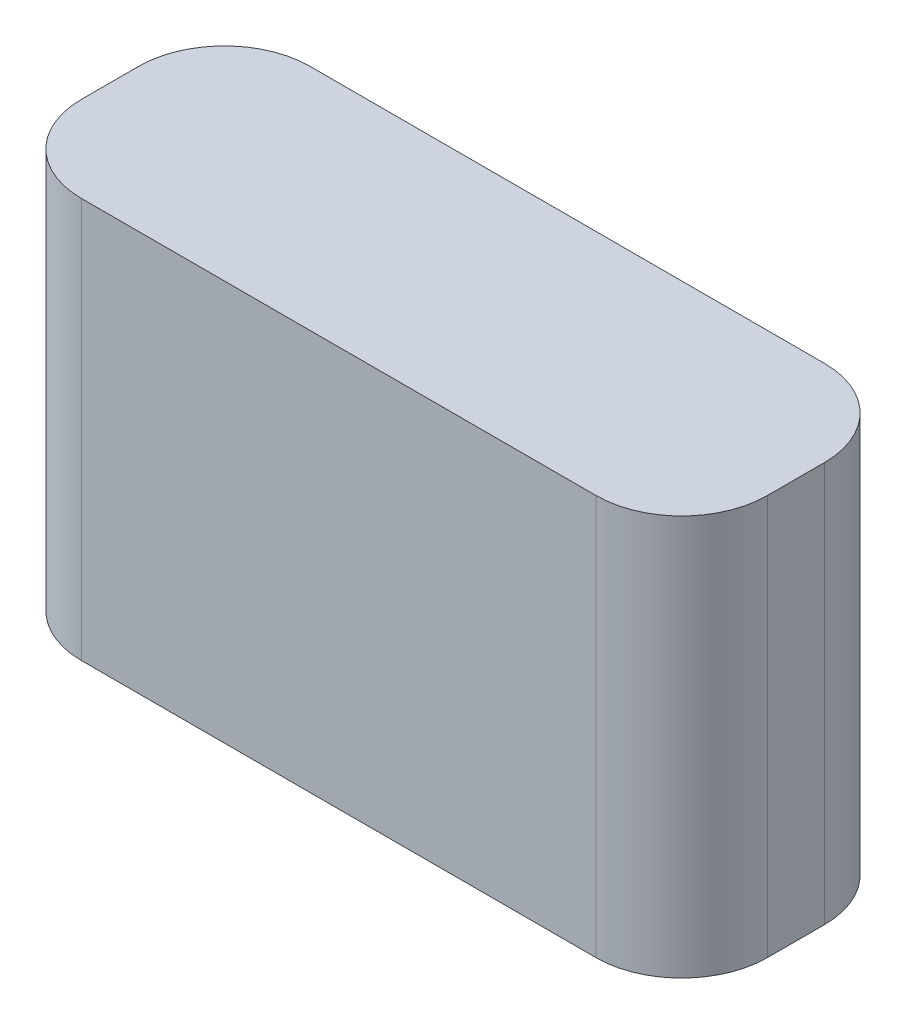
ISO-10303-21;
HEADER;
FILE_DESCRIPTION(('STEP AP214'),'2;1');
FILE_NAME('part.step','',(''),(''),'','','');
FILE_SCHEMA(('AUTOMOTIVE_DESIGN { 1 0 10303 214 1 1 1 1 }'));
ENDSEC;
DATA;
#1=APPLICATION_CONTEXT('core data for automotive mechanical design processes');
#2=APPLICATION_PROTOCOL_DEFINITION('international standard','automotive_design',2000,#1);
#3=PRODUCT_CONTEXT('',#1,'mechanical');
#4=PRODUCT('Part','Part','',(#3));
#5=PRODUCT_RELATED_PRODUCT_CATEGORY('part','',(#4));
#6=PRODUCT_DEFINITION_FORMATION('','',#4);
#7=PRODUCT_DEFINITION_CONTEXT('part definition',#1,'design');
#8=PRODUCT_DEFINITION('design','',#6,#7);
#9=PRODUCT_DEFINITION_SHAPE('','',#8);
#10=(LENGTH_UNIT() NAMED_UNIT(*) SI_UNIT(.MILLI.,.METRE.));
#11=(NAMED_UNIT(*) PLANE_ANGLE_UNIT() SI_UNIT($,.RADIAN.));
#12=(NAMED_UNIT(*) SI_UNIT($,.STERADIAN.) SOLID_ANGLE_UNIT());
#13=UNCERTAINTY_MEASURE_WITH_UNIT(LENGTH_MEASURE(1.E-05),#10,'distance_accuracy_value','');
#14=(GEOMETRIC_REPRESENTATION_CONTEXT(3) GLOBAL_UNCERTAINTY_ASSIGNED_CONTEXT((#13)) GLOBAL_UNIT_ASSIGNED_CONTEXT((#10,
#11,#12)) REPRESENTATION_CONTEXT('',''));
#15=CARTESIAN_POINT('',(0.,0.,0.));
#16=DIRECTION('',(0.,0.,1.));
#17=DIRECTION('',(1.,0.,0.));
#18=AXIS2_PLACEMENT_3D('',#15,#16,#17);
#19=CARTESIAN_POINT('',(45.,70.,-5.00000000000001));
#20=DIRECTION('',(0.,-1.,0.));
#21=DIRECTION('',(0.,0.,-1.));
#22=AXIS2_PLACEMENT_3D('',#19,#20,#21);
#23=CYLINDRICAL_SURFACE('',#22,15.);
#24=CARTESIAN_POINT('',(45.,0.,-5.00000000000001));
#25=DIRECTION('',(0.,1.,0.));
#26=DIRECTION('',(0.,0.,-1.));
#27=AXIS2_PLACEMENT_3D('',#24,#25,#26);
#28=CIRCLE('',#27,15.);
#29=CARTESIAN_POINT('',(60.,0.,-5.00000000000001));
#30=VERTEX_POINT('',#29);
#31=CARTESIAN_POINT('',(45.,0.,-20.));
#32=VERTEX_POINT('',#31);
#33=EDGE_CURVE('E135',#30,#32,#28,.T.);
#34=ORIENTED_EDGE('',*,*,#33,.T.);
#35=DIRECTION('',(0.,-1.,0.));
#36=VECTOR('',#35,1.);
#37=CARTESIAN_POINT('',(45.,70.,-20.));
#38=LINE('',#37,#36);
#39=CARTESIAN_POINT('',(45.,70.,-20.));
#40=VERTEX_POINT('',#39);
#41=EDGE_CURVE('E11',#40,#32,#38,.T.);
#42=ORIENTED_EDGE('',*,*,#41,.F.);
#43=CARTESIAN_POINT('',(45.,70.,-5.00000000000001));
#44=DIRECTION('',(0.,1.,0.));
#45=DIRECTION('',(0.,0.,-1.));
#46=AXIS2_PLACEMENT_3D('',#43,#44,#45);
#47=CIRCLE('',#46,15.);
#48=CARTESIAN_POINT('',(60.,70.,-5.00000000000001));
#49=VERTEX_POINT('',#48);
#50=EDGE_CURVE('E149',#49,#40,#47,.T.);
#51=ORIENTED_EDGE('',*,*,#50,.F.);
#52=DIRECTION('',(0.,-1.,0.));
#53=VECTOR('',#52,1.);
#54=CARTESIAN_POINT('',(60.,70.,-5.00000000000001));
#55=LINE('',#54,#53);
#56=EDGE_CURVE('E131',#49,#30,#55,.T.);
#57=ORIENTED_EDGE('',*,*,#56,.T.);
#58=EDGE_LOOP('',(#34,#42,#51,#57));
#59=FACE_BOUND('',#58,.T.);
#60=ADVANCED_FACE('F39',(#59),#23,.T.);
#61=CARTESIAN_POINT('',(-45.,70.,-20.));
#62=DIRECTION('',(0.,0.,1.));
#63=DIRECTION('',(1.,0.,0.));
#64=AXIS2_PLACEMENT_3D('',#61,#62,#63);
#65=PLANE('',#64);
#66=DIRECTION('',(-1.,0.,0.));
#67=VECTOR('',#66,1.);
#68=CARTESIAN_POINT('',(-45.,0.,-20.));
#69=LINE('',#68,#67);
#70=CARTESIAN_POINT('',(-45.,0.,-20.));
#71=VERTEX_POINT('',#70);
#72=EDGE_CURVE('E138',#32,#71,#69,.T.);
#73=ORIENTED_EDGE('',*,*,#72,.T.);
#74=DIRECTION('',(0.,-1.,0.));
#75=VECTOR('',#74,1.);
#76=CARTESIAN_POINT('',(-45.,70.,-20.));
#77=LINE('',#76,#75);
#78=CARTESIAN_POINT('',(-45.,70.,-20.));
#79=VERTEX_POINT('',#78);
#80=EDGE_CURVE('E47',#79,#71,#77,.T.);
#81=ORIENTED_EDGE('',*,*,#80,.F.);
#82=DIRECTION('',(-1.,0.,0.));
#83=VECTOR('',#82,1.);
#84=CARTESIAN_POINT('',(-45.,70.,-20.));
#85=LINE('',#84,#83);
#86=EDGE_CURVE('E98',#40,#79,#85,.T.);
#87=ORIENTED_EDGE('',*,*,#86,.F.);
#88=ORIENTED_EDGE('',*,*,#41,.T.);
#89=EDGE_LOOP('',(#73,#81,#87,#88));
#90=FACE_BOUND('',#89,.T.);
#91=ADVANCED_FACE('F184',(#90),#65,.F.);
#92=CARTESIAN_POINT('',(-45.,70.,-5.00000000000001));
#93=DIRECTION('',(0.,-1.,0.));
#94=DIRECTION('',(0.,0.,-1.));
#95=AXIS2_PLACEMENT_3D('',#92,#93,#94);
#96=CYLINDRICAL_SURFACE('',#95,15.);
#97=CARTESIAN_POINT('',(-45.,0.,-5.00000000000001));
#98=DIRECTION('',(0.,1.,0.));
#99=DIRECTION('',(0.,0.,-1.));
#100=AXIS2_PLACEMENT_3D('',#97,#98,#99);
#101=CIRCLE('',#100,15.);
#102=CARTESIAN_POINT('',(-60.,0.,-5.00000000000001));
#103=VERTEX_POINT('',#102);
#104=EDGE_CURVE('E140',#71,#103,#101,.T.);
#105=ORIENTED_EDGE('',*,*,#104,.T.);
#106=DIRECTION('',(0.,-1.,0.));
#107=VECTOR('',#106,1.);
#108=CARTESIAN_POINT('',(-60.,70.,-5.00000000000001));
#109=LINE('',#108,#107);
#110=CARTESIAN_POINT('',(-60.,70.,-5.00000000000001));
#111=VERTEX_POINT('',#110);
#112=EDGE_CURVE('E156',#111,#103,#109,.T.);
#113=ORIENTED_EDGE('',*,*,#112,.F.);
#114=CARTESIAN_POINT('',(-45.,70.,-5.00000000000001));
#115=DIRECTION('',(0.,1.,0.));
#116=DIRECTION('',(0.,0.,-1.));
#117=AXIS2_PLACEMENT_3D('',#114,#115,#116);
#118=CIRCLE('',#117,15.);
#119=EDGE_CURVE('E164',#79,#111,#118,.T.);
#120=ORIENTED_EDGE('',*,*,#119,.F.);
#121=ORIENTED_EDGE('',*,*,#80,.T.);
#122=EDGE_LOOP('',(#105,#113,#120,#121));
#123=FACE_BOUND('',#122,.T.);
#124=ADVANCED_FACE('F162',(#123),#96,.T.);
#125=CARTESIAN_POINT('',(-60.,70.,4.99999999999999));
#126=DIRECTION('',(1.,0.,0.));
#127=DIRECTION('',(0.,0.,-1.));
#128=AXIS2_PLACEMENT_3D('',#125,#126,#127);
#129=PLANE('',#128);
#130=DIRECTION('',(0.,0.,1.));
#131=VECTOR('',#130,1.);
#132=CARTESIAN_POINT('',(-60.,0.,4.99999999999999));
#133=LINE('',#132,#131);
#134=CARTESIAN_POINT('',(-60.,0.,4.99999999999999));
#135=VERTEX_POINT('',#134);
#136=EDGE_CURVE('E142',#103,#135,#133,.T.);
#137=ORIENTED_EDGE('',*,*,#136,.T.);
#138=DIRECTION('',(0.,-1.,0.));
#139=VECTOR('',#138,1.);
#140=CARTESIAN_POINT('',(-60.,70.,4.99999999999999));
#141=LINE('',#140,#139);
#142=CARTESIAN_POINT('',(-60.,70.,4.99999999999999));
#143=VERTEX_POINT('',#142);
#144=EDGE_CURVE('E153',#143,#135,#141,.T.);
#145=ORIENTED_EDGE('',*,*,#144,.F.);
#146=DIRECTION('',(0.,0.,1.));
#147=VECTOR('',#146,1.);
#148=CARTESIAN_POINT('',(-60.,70.,4.99999999999999));
#149=LINE('',#148,#147);
#150=EDGE_CURVE('E176',#111,#143,#149,.T.);
#151=ORIENTED_EDGE('',*,*,#150,.F.);
#152=ORIENTED_EDGE('',*,*,#112,.T.);
#153=EDGE_LOOP('',(#137,#145,#151,#152));
#154=FACE_BOUND('',#153,.T.);
#155=ADVANCED_FACE('F172',(#154),#129,.F.);
#156=CARTESIAN_POINT('',(-45.,70.,4.99999999999999));
#157=DIRECTION('',(0.,-1.,0.));
#158=DIRECTION('',(0.,0.,-1.));
#159=AXIS2_PLACEMENT_3D('',#156,#157,#158);
#160=CYLINDRICAL_SURFACE('',#159,15.);
#161=CARTESIAN_POINT('',(-45.,0.,4.99999999999999));
#162=DIRECTION('',(0.,1.,0.));
#163=DIRECTION('',(0.,0.,-1.));
#164=AXIS2_PLACEMENT_3D('',#161,#162,#163);
#165=CIRCLE('',#164,15.);
#166=CARTESIAN_POINT('',(-45.,0.,20.));
#167=VERTEX_POINT('',#166);
#168=EDGE_CURVE('E144',#135,#167,#165,.T.);
#169=ORIENTED_EDGE('',*,*,#168,.T.);
#170=DIRECTION('',(0.,-1.,0.));
#171=VECTOR('',#170,1.);
#172=CARTESIAN_POINT('',(-45.,70.,20.));
#173=LINE('',#172,#171);
#174=CARTESIAN_POINT('',(-45.,70.,20.));
#175=VERTEX_POINT('',#174);
#176=EDGE_CURVE('E126',#175,#167,#173,.T.);
#177=ORIENTED_EDGE('',*,*,#176,.F.);
#178=CARTESIAN_POINT('',(-45.,70.,4.99999999999999));
#179=DIRECTION('',(0.,1.,0.));
#180=DIRECTION('',(0.,0.,-1.));
#181=AXIS2_PLACEMENT_3D('',#178,#179,#180);
#182=CIRCLE('',#181,15.);
#183=EDGE_CURVE('E117',#143,#175,#182,.T.);
#184=ORIENTED_EDGE('',*,*,#183,.F.);
#185=ORIENTED_EDGE('',*,*,#144,.T.);
#186=EDGE_LOOP('',(#169,#177,#184,#185));
#187=FACE_BOUND('',#186,.T.);
#188=ADVANCED_FACE('F175',(#187),#160,.T.);
#189=CARTESIAN_POINT('',(-45.,70.,20.));
#190=DIRECTION('',(0.,0.,-1.));
#191=DIRECTION('',(-1.,0.,0.));
#192=AXIS2_PLACEMENT_3D('',#189,#190,#191);
#193=PLANE('',#192);
#194=DIRECTION('',(1.,0.,0.));
#195=VECTOR('',#194,1.);
#196=CARTESIAN_POINT('',(-45.,0.,20.));
#197=LINE('',#196,#195);
#198=CARTESIAN_POINT('',(45.,0.,20.));
#199=VERTEX_POINT('',#198);
#200=EDGE_CURVE('E125',#167,#199,#197,.T.);
#201=ORIENTED_EDGE('',*,*,#200,.T.);
#202=DIRECTION('',(0.,-1.,0.));
#203=VECTOR('',#202,1.);
#204=CARTESIAN_POINT('',(45.,70.,20.));
#205=LINE('',#204,#203);
#206=CARTESIAN_POINT('',(45.,70.,20.));
#207=VERTEX_POINT('',#206);
#208=EDGE_CURVE('E122',#207,#199,#205,.T.);
#209=ORIENTED_EDGE('',*,*,#208,.F.);
#210=DIRECTION('',(1.,0.,0.));
#211=VECTOR('',#210,1.);
#212=CARTESIAN_POINT('',(-45.,70.,20.));
#213=LINE('',#212,#211);
#214=EDGE_CURVE('E111',#175,#207,#213,.T.);
#215=ORIENTED_EDGE('',*,*,#214,.F.);
#216=ORIENTED_EDGE('',*,*,#176,.T.);
#217=EDGE_LOOP('',(#201,#209,#215,#216));
#218=FACE_BOUND('',#217,.T.);
#219=ADVANCED_FACE('F123',(#218),#193,.F.);
#220=CARTESIAN_POINT('',(45.,70.,4.99999999999999));
#221=DIRECTION('',(0.,-1.,0.));
#222=DIRECTION('',(0.,0.,-1.));
#223=AXIS2_PLACEMENT_3D('',#220,#221,#222);
#224=CYLINDRICAL_SURFACE('',#223,15.);
#225=CARTESIAN_POINT('',(45.,0.,4.99999999999999));
#226=DIRECTION('',(0.,1.,0.));
#227=DIRECTION('',(0.,0.,1.));
#228=AXIS2_PLACEMENT_3D('',#225,#226,#227);
#229=CIRCLE('',#228,15.);
#230=CARTESIAN_POINT('',(60.,0.,4.99999999999999));
#231=VERTEX_POINT('',#230);
#232=EDGE_CURVE('E84',#199,#231,#229,.T.);
#233=ORIENTED_EDGE('',*,*,#232,.T.);
#234=DIRECTION('',(0.,-1.,0.));
#235=VECTOR('',#234,1.);
#236=CARTESIAN_POINT('',(60.,70.,4.99999999999999));
#237=LINE('',#236,#235);
#238=CARTESIAN_POINT('',(60.,70.,4.99999999999999));
#239=VERTEX_POINT('',#238);
#240=EDGE_CURVE('E127',#239,#231,#237,.T.);
#241=ORIENTED_EDGE('',*,*,#240,.F.);
#242=CARTESIAN_POINT('',(45.,70.,4.99999999999999));
#243=DIRECTION('',(0.,1.,0.));
#244=DIRECTION('',(0.,0.,1.));
#245=AXIS2_PLACEMENT_3D('',#242,#243,#244);
#246=CIRCLE('',#245,15.);
#247=EDGE_CURVE('E115',#207,#239,#246,.T.);
#248=ORIENTED_EDGE('',*,*,#247,.F.);
#249=ORIENTED_EDGE('',*,*,#208,.T.);
#250=EDGE_LOOP('',(#233,#241,#248,#249));
#251=FACE_BOUND('',#250,.T.);
#252=ADVANCED_FACE('F129',(#251),#224,.T.);
#253=CARTESIAN_POINT('',(60.,70.,4.99999999999999));
#254=DIRECTION('',(-1.,0.,0.));
#255=DIRECTION('',(0.,0.,1.));
#256=AXIS2_PLACEMENT_3D('',#253,#254,#255);
#257=PLANE('',#256);
#258=DIRECTION('',(0.,0.,-1.));
#259=VECTOR('',#258,1.);
#260=CARTESIAN_POINT('',(60.,0.,4.99999999999999));
#261=LINE('',#260,#259);
#262=EDGE_CURVE('E90',#231,#30,#261,.T.);
#263=ORIENTED_EDGE('',*,*,#262,.T.);
#264=ORIENTED_EDGE('',*,*,#56,.F.);
#265=DIRECTION('',(0.,0.,-1.));
#266=VECTOR('',#265,1.);
#267=CARTESIAN_POINT('',(60.,70.,4.99999999999999));
#268=LINE('',#267,#266);
#269=EDGE_CURVE('E55',#239,#49,#268,.T.);
#270=ORIENTED_EDGE('',*,*,#269,.F.);
#271=ORIENTED_EDGE('',*,*,#240,.T.);
#272=EDGE_LOOP('',(#263,#264,#270,#271));
#273=FACE_BOUND('',#272,.T.);
#274=ADVANCED_FACE('F200',(#273),#257,.F.);
#275=CARTESIAN_POINT('',(45.,70.,-5.00000000000001));
#276=DIRECTION('',(0.,-1.,0.));
#277=DIRECTION('',(0.,0.,-1.));
#278=AXIS2_PLACEMENT_3D('',#275,#276,#277);
#279=PLANE('',#278);
#280=ORIENTED_EDGE('',*,*,#50,.T.);
#281=ORIENTED_EDGE('',*,*,#86,.T.);
#282=ORIENTED_EDGE('',*,*,#119,.T.);
#283=ORIENTED_EDGE('',*,*,#150,.T.);
#284=ORIENTED_EDGE('',*,*,#183,.T.);
#285=ORIENTED_EDGE('',*,*,#214,.T.);
#286=ORIENTED_EDGE('',*,*,#247,.T.);
#287=ORIENTED_EDGE('',*,*,#269,.T.);
#288=EDGE_LOOP('',(#280,#281,#282,#283,#284,#285,#286,#287));
#289=FACE_BOUND('',#288,.T.);
#290=ADVANCED_FACE('F113',(#289),#279,.F.);
#291=CARTESIAN_POINT('',(45.,0.,-5.00000000000001));
#292=DIRECTION('',(0.,-1.,0.));
#293=DIRECTION('',(0.,0.,-1.));
#294=AXIS2_PLACEMENT_3D('',#291,#292,#293);
#295=PLANE('',#294);
#296=ORIENTED_EDGE('',*,*,#33,.F.);
#297=ORIENTED_EDGE('',*,*,#262,.F.);
#298=ORIENTED_EDGE('',*,*,#232,.F.);
#299=ORIENTED_EDGE('',*,*,#200,.F.);
#300=ORIENTED_EDGE('',*,*,#168,.F.);
#301=ORIENTED_EDGE('',*,*,#136,.F.);
#302=ORIENTED_EDGE('',*,*,#104,.F.);
#303=ORIENTED_EDGE('',*,*,#72,.F.);
#304=EDGE_LOOP('',(#296,#297,#298,#299,#300,#301,#302,#303));
#305=FACE_BOUND('',#304,.T.);
#306=ADVANCED_FACE('F168',(#305),#295,.T.);
#307=CLOSED_SHELL('',(#60,#91,#124,#155,#188,#219,#252,#274,#290,#306));
#308=MANIFOLD_SOLID_BREP('B2',#307);
#309=ADVANCED_BREP_SHAPE_REPRESENTATION('',(#18,#308),#14);
#310=SHAPE_DEFINITION_REPRESENTATION(#9,#309);
ENDSEC;
END-ISO-10303-21;
